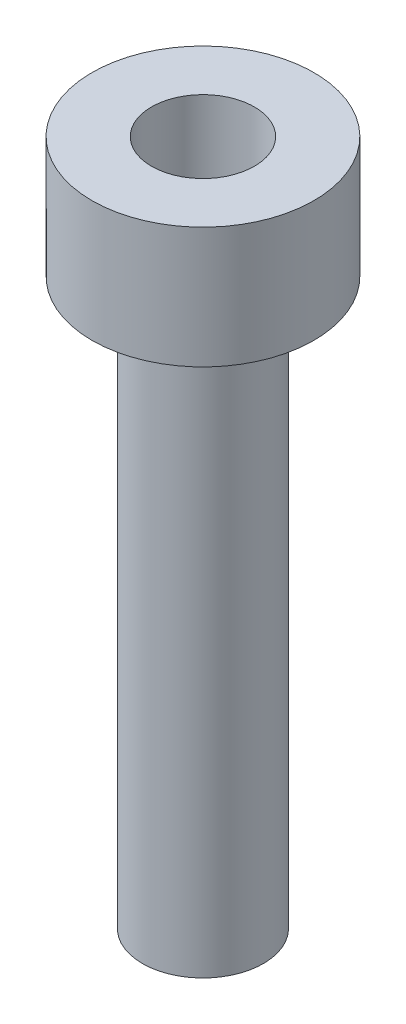
ISO-10303-21;
HEADER;
FILE_DESCRIPTION(('STEP AP214'),'2;1');
FILE_NAME('part.step','',(''),(''),'','','');
FILE_SCHEMA(('AUTOMOTIVE_DESIGN { 1 0 10303 214 1 1 1 1 }'));
ENDSEC;
DATA;
#1=APPLICATION_CONTEXT('core data for automotive mechanical design processes');
#2=APPLICATION_PROTOCOL_DEFINITION('international standard','automotive_design',2000,#1);
#3=PRODUCT_CONTEXT('',#1,'mechanical');
#4=PRODUCT('Part','Part','',(#3));
#5=PRODUCT_RELATED_PRODUCT_CATEGORY('part','',(#4));
#6=PRODUCT_DEFINITION_FORMATION('','',#4);
#7=PRODUCT_DEFINITION_CONTEXT('part definition',#1,'design');
#8=PRODUCT_DEFINITION('design','',#6,#7);
#9=PRODUCT_DEFINITION_SHAPE('','',#8);
#10=(LENGTH_UNIT() NAMED_UNIT(*) SI_UNIT(.MILLI.,.METRE.));
#11=(NAMED_UNIT(*) PLANE_ANGLE_UNIT() SI_UNIT($,.RADIAN.));
#12=(NAMED_UNIT(*) SI_UNIT($,.STERADIAN.) SOLID_ANGLE_UNIT());
#13=UNCERTAINTY_MEASURE_WITH_UNIT(LENGTH_MEASURE(1.E-05),#10,'distance_accuracy_value','');
#14=(GEOMETRIC_REPRESENTATION_CONTEXT(3) GLOBAL_UNCERTAINTY_ASSIGNED_CONTEXT((#13)) GLOBAL_UNIT_ASSIGNED_CONTEXT((#10,
#11,#12)) REPRESENTATION_CONTEXT('',''));
#15=CARTESIAN_POINT('',(0.,0.,0.));
#16=DIRECTION('',(0.,0.,1.));
#17=DIRECTION('',(1.,0.,0.));
#18=AXIS2_PLACEMENT_3D('',#15,#16,#17);
#19=CARTESIAN_POINT('',(0.,3.,0.));
#20=DIRECTION('',(0.,-1.,0.));
#21=DIRECTION('',(0.,0.,-1.));
#22=AXIS2_PLACEMENT_3D('',#19,#20,#21);
#23=CYLINDRICAL_SURFACE('',#22,2.75);
#24=CARTESIAN_POINT('',(0.,3.,0.));
#25=DIRECTION('',(0.,1.,0.));
#26=DIRECTION('',(0.,0.,1.));
#27=AXIS2_PLACEMENT_3D('',#24,#25,#26);
#28=CIRCLE('',#27,2.75);
#29=CARTESIAN_POINT('',(0.,3.,2.75));
#30=VERTEX_POINT('',#29);
#31=EDGE_CURVE('E10',#30,#30,#28,.T.);
#32=ORIENTED_EDGE('',*,*,#31,.F.);
#33=EDGE_LOOP('',(#32));
#34=FACE_BOUND('',#33,.T.);
#35=CARTESIAN_POINT('',(0.,0.,0.));
#36=DIRECTION('',(0.,1.,0.));
#37=DIRECTION('',(0.,0.,1.));
#38=AXIS2_PLACEMENT_3D('',#35,#36,#37);
#39=CIRCLE('',#38,2.75);
#40=CARTESIAN_POINT('',(0.,0.,2.75));
#41=VERTEX_POINT('',#40);
#42=EDGE_CURVE('E42',#41,#41,#39,.T.);
#43=ORIENTED_EDGE('',*,*,#42,.T.);
#44=EDGE_LOOP('',(#43));
#45=FACE_BOUND('',#44,.T.);
#46=ADVANCED_FACE('F41',(#34,#45),#23,.T.);
#47=CARTESIAN_POINT('',(0.,3.,0.));
#48=DIRECTION('',(0.,1.,0.));
#49=DIRECTION('',(0.,0.,1.));
#50=AXIS2_PLACEMENT_3D('',#47,#48,#49);
#51=PLANE('',#50);
#52=CARTESIAN_POINT('',(0.,3.,0.));
#53=DIRECTION('',(0.,1.,0.));
#54=DIRECTION('',(0.,0.,1.));
#55=AXIS2_PLACEMENT_3D('',#52,#53,#54);
#56=CIRCLE('',#55,1.275);
#57=CARTESIAN_POINT('',(0.,3.,1.275));
#58=VERTEX_POINT('',#57);
#59=EDGE_CURVE('E56',#58,#58,#56,.T.);
#60=ORIENTED_EDGE('',*,*,#59,.F.);
#61=EDGE_LOOP('',(#60));
#62=FACE_BOUND('',#61,.T.);
#63=ORIENTED_EDGE('',*,*,#31,.T.);
#64=EDGE_LOOP('',(#63));
#65=FACE_BOUND('',#64,.T.);
#66=ADVANCED_FACE('F74',(#62,#65),#51,.T.);
#67=CARTESIAN_POINT('',(0.,0.,0.));
#68=DIRECTION('',(0.,1.,0.));
#69=DIRECTION('',(0.,0.,1.));
#70=AXIS2_PLACEMENT_3D('',#67,#68,#69);
#71=PLANE('',#70);
#72=CARTESIAN_POINT('',(0.,0.,0.));
#73=DIRECTION('',(0.,1.,0.));
#74=DIRECTION('',(0.,0.,1.));
#75=AXIS2_PLACEMENT_3D('',#72,#73,#74);
#76=CIRCLE('',#75,1.5);
#77=CARTESIAN_POINT('',(0.,0.,1.5));
#78=VERTEX_POINT('',#77);
#79=EDGE_CURVE('E51',#78,#78,#76,.T.);
#80=ORIENTED_EDGE('',*,*,#79,.T.);
#81=EDGE_LOOP('',(#80));
#82=FACE_BOUND('',#81,.T.);
#83=ORIENTED_EDGE('',*,*,#42,.F.);
#84=EDGE_LOOP('',(#83));
#85=FACE_BOUND('',#84,.T.);
#86=ADVANCED_FACE('F78',(#82,#85),#71,.F.);
#87=CARTESIAN_POINT('',(0.,0.,0.));
#88=DIRECTION('',(0.,-1.,0.));
#89=DIRECTION('',(0.,0.,-1.));
#90=AXIS2_PLACEMENT_3D('',#87,#88,#89);
#91=CYLINDRICAL_SURFACE('',#90,1.5);
#92=ORIENTED_EDGE('',*,*,#79,.F.);
#93=EDGE_LOOP('',(#92));
#94=FACE_BOUND('',#93,.T.);
#95=CARTESIAN_POINT('',(0.,-14.,0.));
#96=DIRECTION('',(0.,1.,0.));
#97=DIRECTION('',(0.,0.,1.));
#98=AXIS2_PLACEMENT_3D('',#95,#96,#97);
#99=CIRCLE('',#98,1.5);
#100=CARTESIAN_POINT('',(0.,-14.,1.5));
#101=VERTEX_POINT('',#100);
#102=EDGE_CURVE('E52',#101,#101,#99,.T.);
#103=ORIENTED_EDGE('',*,*,#102,.T.);
#104=EDGE_LOOP('',(#103));
#105=FACE_BOUND('',#104,.T.);
#106=ADVANCED_FACE('F85',(#94,#105),#91,.T.);
#107=CARTESIAN_POINT('',(0.,-14.,0.));
#108=DIRECTION('',(0.,1.,0.));
#109=DIRECTION('',(0.,0.,1.));
#110=AXIS2_PLACEMENT_3D('',#107,#108,#109);
#111=PLANE('',#110);
#112=ORIENTED_EDGE('',*,*,#102,.F.);
#113=EDGE_LOOP('',(#112));
#114=FACE_BOUND('',#113,.T.);
#115=ADVANCED_FACE('F66',(#114),#111,.F.);
#116=CARTESIAN_POINT('',(0.,1.2,0.));
#117=DIRECTION('',(0.,1.,0.));
#118=DIRECTION('',(0.,0.,1.));
#119=AXIS2_PLACEMENT_3D('',#116,#117,#118);
#120=CYLINDRICAL_SURFACE('',#119,1.275);
#121=CARTESIAN_POINT('',(0.,1.2,0.));
#122=DIRECTION('',(0.,1.,0.));
#123=DIRECTION('',(0.,0.,1.));
#124=AXIS2_PLACEMENT_3D('',#121,#122,#123);
#125=CIRCLE('',#124,1.275);
#126=CARTESIAN_POINT('',(0.,1.2,1.275));
#127=VERTEX_POINT('',#126);
#128=EDGE_CURVE('E57',#127,#127,#125,.T.);
#129=ORIENTED_EDGE('',*,*,#128,.F.);
#130=EDGE_LOOP('',(#129));
#131=FACE_BOUND('',#130,.T.);
#132=ORIENTED_EDGE('',*,*,#59,.T.);
#133=EDGE_LOOP('',(#132));
#134=FACE_BOUND('',#133,.T.);
#135=ADVANCED_FACE('F70',(#131,#134),#120,.F.);
#136=CARTESIAN_POINT('',(0.,1.2,0.));
#137=DIRECTION('',(0.,1.,0.));
#138=DIRECTION('',(0.,0.,1.));
#139=AXIS2_PLACEMENT_3D('',#136,#137,#138);
#140=PLANE('',#139);
#141=ORIENTED_EDGE('',*,*,#128,.T.);
#142=EDGE_LOOP('',(#141));
#143=FACE_BOUND('',#142,.T.);
#144=ADVANCED_FACE('F62',(#143),#140,.T.);
#145=CLOSED_SHELL('',(#46,#66,#86,#106,#115,#135,#144));
#146=MANIFOLD_SOLID_BREP('B2',#145);
#147=ADVANCED_BREP_SHAPE_REPRESENTATION('',(#18,#146),#14);
#148=SHAPE_DEFINITION_REPRESENTATION(#9,#147);
ENDSEC;
END-ISO-10303-21;
